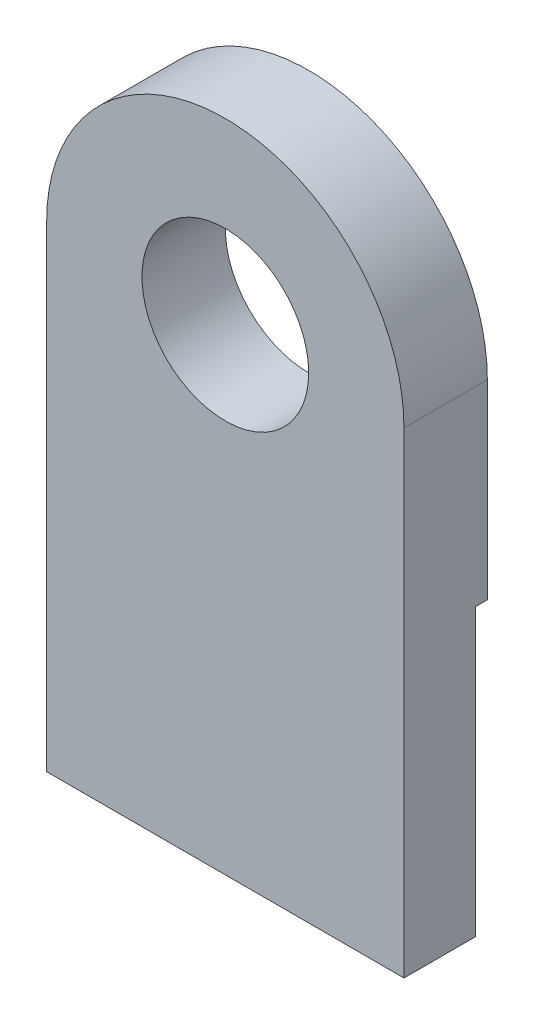
ISO-10303-21;
HEADER;
FILE_DESCRIPTION(('STEP AP214'),'2;1');
FILE_NAME('part.step','',(''),(''),'','','');
FILE_SCHEMA(('AUTOMOTIVE_DESIGN { 1 0 10303 214 1 1 1 1 }'));
ENDSEC;
DATA;
#1=APPLICATION_CONTEXT('core data for automotive mechanical design processes');
#2=APPLICATION_PROTOCOL_DEFINITION('international standard','automotive_design',2000,#1);
#3=PRODUCT_CONTEXT('',#1,'mechanical');
#4=PRODUCT('Part','Part','',(#3));
#5=PRODUCT_RELATED_PRODUCT_CATEGORY('part','',(#4));
#6=PRODUCT_DEFINITION_FORMATION('','',#4);
#7=PRODUCT_DEFINITION_CONTEXT('part definition',#1,'design');
#8=PRODUCT_DEFINITION('design','',#6,#7);
#9=PRODUCT_DEFINITION_SHAPE('','',#8);
#10=(LENGTH_UNIT() NAMED_UNIT(*) SI_UNIT(.MILLI.,.METRE.));
#11=(NAMED_UNIT(*) PLANE_ANGLE_UNIT() SI_UNIT($,.RADIAN.));
#12=(NAMED_UNIT(*) SI_UNIT($,.STERADIAN.) SOLID_ANGLE_UNIT());
#13=UNCERTAINTY_MEASURE_WITH_UNIT(LENGTH_MEASURE(1.E-05),#10,'distance_accuracy_value','');
#14=(GEOMETRIC_REPRESENTATION_CONTEXT(3) GLOBAL_UNCERTAINTY_ASSIGNED_CONTEXT((#13)) GLOBAL_UNIT_ASSIGNED_CONTEXT((#10,
#11,#12)) REPRESENTATION_CONTEXT('',''));
#15=CARTESIAN_POINT('',(0.,0.,0.));
#16=DIRECTION('',(0.,0.,1.));
#17=DIRECTION('',(1.,0.,0.));
#18=AXIS2_PLACEMENT_3D('',#15,#16,#17);
#19=CARTESIAN_POINT('',(0.,0.,3.));
#20=DIRECTION('',(1.,0.,0.));
#21=DIRECTION('',(0.,0.,-1.));
#22=AXIS2_PLACEMENT_3D('',#19,#20,#21);
#23=PLANE('',#22);
#24=DIRECTION('',(0.,-1.,0.));
#25=VECTOR('',#24,1.);
#26=CARTESIAN_POINT('',(0.,0.,0.));
#27=LINE('',#26,#25);
#28=CARTESIAN_POINT('',(0.,12.,0.));
#29=VERTEX_POINT('',#28);
#30=CARTESIAN_POINT('',(0.,0.,0.));
#31=VERTEX_POINT('',#30);
#32=EDGE_CURVE('E92',#29,#31,#27,.T.);
#33=ORIENTED_EDGE('',*,*,#32,.T.);
#34=DIRECTION('',(0.,0.,-1.));
#35=VECTOR('',#34,1.);
#36=CARTESIAN_POINT('',(0.,0.,3.));
#37=LINE('',#36,#35);
#38=CARTESIAN_POINT('',(0.,0.,3.));
#39=VERTEX_POINT('',#38);
#40=EDGE_CURVE('E11',#39,#31,#37,.T.);
#41=ORIENTED_EDGE('',*,*,#40,.F.);
#42=DIRECTION('',(0.,-1.,0.));
#43=VECTOR('',#42,1.);
#44=CARTESIAN_POINT('',(0.,0.,3.));
#45=LINE('',#44,#43);
#46=CARTESIAN_POINT('',(0.,20.,3.));
#47=VERTEX_POINT('',#46);
#48=EDGE_CURVE('E97',#47,#39,#45,.T.);
#49=ORIENTED_EDGE('',*,*,#48,.F.);
#50=DIRECTION('',(0.,0.,1.));
#51=VECTOR('',#50,1.);
#52=CARTESIAN_POINT('',(0.,20.,-0.5));
#53=LINE('',#52,#51);
#54=CARTESIAN_POINT('',(0.,20.,-0.5));
#55=VERTEX_POINT('',#54);
#56=EDGE_CURVE('E109',#55,#47,#53,.T.);
#57=ORIENTED_EDGE('',*,*,#56,.F.);
#58=DIRECTION('',(0.,1.,0.));
#59=VECTOR('',#58,1.);
#60=CARTESIAN_POINT('',(0.,0.,-0.5));
#61=LINE('',#60,#59);
#62=CARTESIAN_POINT('',(0.,12.,-0.5));
#63=VERTEX_POINT('',#62);
#64=EDGE_CURVE('E159',#63,#55,#61,.T.);
#65=ORIENTED_EDGE('',*,*,#64,.F.);
#66=DIRECTION('',(0.,0.,1.));
#67=VECTOR('',#66,1.);
#68=CARTESIAN_POINT('',(0.,12.,-0.5));
#69=LINE('',#68,#67);
#70=EDGE_CURVE('E104',#63,#29,#69,.T.);
#71=ORIENTED_EDGE('',*,*,#70,.T.);
#72=EDGE_LOOP('',(#33,#41,#49,#57,#65,#71));
#73=FACE_BOUND('',#72,.T.);
#74=ADVANCED_FACE('F41',(#73),#23,.F.);
#75=CARTESIAN_POINT('',(0.,0.,3.));
#76=DIRECTION('',(0.,1.,0.));
#77=DIRECTION('',(0.,0.,1.));
#78=AXIS2_PLACEMENT_3D('',#75,#76,#77);
#79=PLANE('',#78);
#80=DIRECTION('',(1.,0.,0.));
#81=VECTOR('',#80,1.);
#82=CARTESIAN_POINT('',(0.,0.,0.));
#83=LINE('',#82,#81);
#84=CARTESIAN_POINT('',(15.,0.,0.));
#85=VERTEX_POINT('',#84);
#86=EDGE_CURVE('E69',#31,#85,#83,.T.);
#87=ORIENTED_EDGE('',*,*,#86,.T.);
#88=DIRECTION('',(0.,0.,-1.));
#89=VECTOR('',#88,1.);
#90=CARTESIAN_POINT('',(15.,0.,3.));
#91=LINE('',#90,#89);
#92=CARTESIAN_POINT('',(15.,0.,3.));
#93=VERTEX_POINT('',#92);
#94=EDGE_CURVE('E50',#93,#85,#91,.T.);
#95=ORIENTED_EDGE('',*,*,#94,.F.);
#96=DIRECTION('',(1.,0.,0.));
#97=VECTOR('',#96,1.);
#98=CARTESIAN_POINT('',(0.,0.,3.));
#99=LINE('',#98,#97);
#100=EDGE_CURVE('E58',#39,#93,#99,.T.);
#101=ORIENTED_EDGE('',*,*,#100,.F.);
#102=ORIENTED_EDGE('',*,*,#40,.T.);
#103=EDGE_LOOP('',(#87,#95,#101,#102));
#104=FACE_BOUND('',#103,.T.);
#105=ADVANCED_FACE('F180',(#104),#79,.F.);
#106=CARTESIAN_POINT('',(15.,0.,3.));
#107=DIRECTION('',(-1.,0.,0.));
#108=DIRECTION('',(0.,0.,1.));
#109=AXIS2_PLACEMENT_3D('',#106,#107,#108);
#110=PLANE('',#109);
#111=DIRECTION('',(0.,1.,0.));
#112=VECTOR('',#111,1.);
#113=CARTESIAN_POINT('',(15.,0.,0.));
#114=LINE('',#113,#112);
#115=CARTESIAN_POINT('',(15.,12.,0.));
#116=VERTEX_POINT('',#115);
#117=EDGE_CURVE('E75',#85,#116,#114,.T.);
#118=ORIENTED_EDGE('',*,*,#117,.T.);
#119=DIRECTION('',(0.,0.,1.));
#120=VECTOR('',#119,1.);
#121=CARTESIAN_POINT('',(15.,12.,-0.5));
#122=LINE('',#121,#120);
#123=CARTESIAN_POINT('',(15.,12.,-0.5));
#124=VERTEX_POINT('',#123);
#125=EDGE_CURVE('E81',#124,#116,#122,.T.);
#126=ORIENTED_EDGE('',*,*,#125,.F.);
#127=DIRECTION('',(0.,1.,0.));
#128=VECTOR('',#127,1.);
#129=CARTESIAN_POINT('',(15.,0.,-0.5));
#130=LINE('',#129,#128);
#131=CARTESIAN_POINT('',(15.,20.,-0.5));
#132=VERTEX_POINT('',#131);
#133=EDGE_CURVE('E140',#124,#132,#130,.T.);
#134=ORIENTED_EDGE('',*,*,#133,.T.);
#135=DIRECTION('',(0.,0.,1.));
#136=VECTOR('',#135,1.);
#137=CARTESIAN_POINT('',(15.,20.,-0.5));
#138=LINE('',#137,#136);
#139=CARTESIAN_POINT('',(15.,20.,3.));
#140=VERTEX_POINT('',#139);
#141=EDGE_CURVE('E118',#132,#140,#138,.T.);
#142=ORIENTED_EDGE('',*,*,#141,.T.);
#143=DIRECTION('',(0.,1.,0.));
#144=VECTOR('',#143,1.);
#145=CARTESIAN_POINT('',(15.,0.,3.));
#146=LINE('',#145,#144);
#147=EDGE_CURVE('E126',#93,#140,#146,.T.);
#148=ORIENTED_EDGE('',*,*,#147,.F.);
#149=ORIENTED_EDGE('',*,*,#94,.T.);
#150=EDGE_LOOP('',(#118,#126,#134,#142,#148,#149));
#151=FACE_BOUND('',#150,.T.);
#152=ADVANCED_FACE('F77',(#151),#110,.F.);
#153=CARTESIAN_POINT('',(0.,0.,3.));
#154=DIRECTION('',(0.,0.,-1.));
#155=DIRECTION('',(-1.,0.,0.));
#156=AXIS2_PLACEMENT_3D('',#153,#154,#155);
#157=PLANE('',#156);
#158=ORIENTED_EDGE('',*,*,#48,.T.);
#159=ORIENTED_EDGE('',*,*,#100,.T.);
#160=ORIENTED_EDGE('',*,*,#147,.T.);
#161=CARTESIAN_POINT('',(7.5,20.,3.));
#162=DIRECTION('',(0.,0.,1.));
#163=DIRECTION('',(1.,0.,0.));
#164=AXIS2_PLACEMENT_3D('',#161,#162,#163);
#165=CIRCLE('',#164,7.5);
#166=EDGE_CURVE('E112',#140,#47,#165,.T.);
#167=ORIENTED_EDGE('',*,*,#166,.T.);
#168=EDGE_LOOP('',(#158,#159,#160,#167));
#169=FACE_BOUND('',#168,.T.);
#170=CARTESIAN_POINT('',(7.5,20.,3.));
#171=DIRECTION('',(0.,0.,1.));
#172=DIRECTION('',(1.,0.,0.));
#173=AXIS2_PLACEMENT_3D('',#170,#171,#172);
#174=CIRCLE('',#173,3.5);
#175=CARTESIAN_POINT('',(11.,20.,3.));
#176=VERTEX_POINT('',#175);
#177=EDGE_CURVE('E148',#176,#176,#174,.T.);
#178=ORIENTED_EDGE('',*,*,#177,.F.);
#179=EDGE_LOOP('',(#178));
#180=FACE_BOUND('',#179,.T.);
#181=ADVANCED_FACE('F133',(#169,#180),#157,.F.);
#182=CARTESIAN_POINT('',(0.,0.,0.));
#183=DIRECTION('',(0.,0.,-1.));
#184=DIRECTION('',(-1.,0.,0.));
#185=AXIS2_PLACEMENT_3D('',#182,#183,#184);
#186=PLANE('',#185);
#187=ORIENTED_EDGE('',*,*,#32,.F.);
#188=DIRECTION('',(-1.,0.,0.));
#189=VECTOR('',#188,1.);
#190=CARTESIAN_POINT('',(0.,12.,0.));
#191=LINE('',#190,#189);
#192=EDGE_CURVE('E86',#116,#29,#191,.T.);
#193=ORIENTED_EDGE('',*,*,#192,.F.);
#194=ORIENTED_EDGE('',*,*,#117,.F.);
#195=ORIENTED_EDGE('',*,*,#86,.F.);
#196=EDGE_LOOP('',(#187,#193,#194,#195));
#197=FACE_BOUND('',#196,.T.);
#198=ADVANCED_FACE('F90',(#197),#186,.T.);
#199=CARTESIAN_POINT('',(0.,12.,-0.5));
#200=DIRECTION('',(0.,1.,0.));
#201=DIRECTION('',(0.,0.,1.));
#202=AXIS2_PLACEMENT_3D('',#199,#200,#201);
#203=PLANE('',#202);
#204=ORIENTED_EDGE('',*,*,#125,.T.);
#205=ORIENTED_EDGE('',*,*,#192,.T.);
#206=ORIENTED_EDGE('',*,*,#70,.F.);
#207=DIRECTION('',(-1.,0.,0.));
#208=VECTOR('',#207,1.);
#209=CARTESIAN_POINT('',(0.,12.,-0.5));
#210=LINE('',#209,#208);
#211=EDGE_CURVE('E101',#124,#63,#210,.T.);
#212=ORIENTED_EDGE('',*,*,#211,.F.);
#213=EDGE_LOOP('',(#204,#205,#206,#212));
#214=FACE_BOUND('',#213,.T.);
#215=ADVANCED_FACE('F99',(#214),#203,.F.);
#216=CARTESIAN_POINT('',(7.5,20.,-0.5));
#217=DIRECTION('',(0.,0.,1.));
#218=DIRECTION('',(1.,0.,0.));
#219=AXIS2_PLACEMENT_3D('',#216,#217,#218);
#220=CYLINDRICAL_SURFACE('',#219,3.5);
#221=CARTESIAN_POINT('',(7.5,20.,-0.5));
#222=DIRECTION('',(0.,0.,1.));
#223=DIRECTION('',(1.,0.,0.));
#224=AXIS2_PLACEMENT_3D('',#221,#222,#223);
#225=CIRCLE('',#224,3.5);
#226=CARTESIAN_POINT('',(11.,20.,-0.5));
#227=VERTEX_POINT('',#226);
#228=EDGE_CURVE('E147',#227,#227,#225,.T.);
#229=ORIENTED_EDGE('',*,*,#228,.F.);
#230=EDGE_LOOP('',(#229));
#231=FACE_BOUND('',#230,.T.);
#232=ORIENTED_EDGE('',*,*,#177,.T.);
#233=EDGE_LOOP('',(#232));
#234=FACE_BOUND('',#233,.T.);
#235=ADVANCED_FACE('F192',(#231,#234),#220,.F.);
#236=CARTESIAN_POINT('',(7.5,20.,-0.5));
#237=DIRECTION('',(0.,0.,1.));
#238=DIRECTION('',(1.,0.,0.));
#239=AXIS2_PLACEMENT_3D('',#236,#237,#238);
#240=CYLINDRICAL_SURFACE('',#239,7.5);
#241=ORIENTED_EDGE('',*,*,#166,.F.);
#242=ORIENTED_EDGE('',*,*,#141,.F.);
#243=CARTESIAN_POINT('',(7.5,20.,-0.5));
#244=DIRECTION('',(0.,0.,1.));
#245=DIRECTION('',(1.,0.,0.));
#246=AXIS2_PLACEMENT_3D('',#243,#244,#245);
#247=CIRCLE('',#246,7.5);
#248=EDGE_CURVE('E163',#132,#55,#247,.T.);
#249=ORIENTED_EDGE('',*,*,#248,.T.);
#250=ORIENTED_EDGE('',*,*,#56,.T.);
#251=EDGE_LOOP('',(#241,#242,#249,#250));
#252=FACE_BOUND('',#251,.T.);
#253=ADVANCED_FACE('F144',(#252),#240,.T.);
#254=CARTESIAN_POINT('',(0.,0.,-0.5));
#255=DIRECTION('',(0.,0.,1.));
#256=DIRECTION('',(1.,0.,0.));
#257=AXIS2_PLACEMENT_3D('',#254,#255,#256);
#258=PLANE('',#257);
#259=ORIENTED_EDGE('',*,*,#228,.T.);
#260=EDGE_LOOP('',(#259));
#261=FACE_BOUND('',#260,.T.);
#262=ORIENTED_EDGE('',*,*,#133,.F.);
#263=ORIENTED_EDGE('',*,*,#211,.T.);
#264=ORIENTED_EDGE('',*,*,#64,.T.);
#265=ORIENTED_EDGE('',*,*,#248,.F.);
#266=EDGE_LOOP('',(#262,#263,#264,#265));
#267=FACE_BOUND('',#266,.T.);
#268=ADVANCED_FACE('F171',(#261,#267),#258,.F.);
#269=CLOSED_SHELL('',(#74,#105,#152,#181,#198,#215,#235,#253,#268));
#270=MANIFOLD_SOLID_BREP('B2',#269);
#271=ADVANCED_BREP_SHAPE_REPRESENTATION('',(#18,#270),#14);
#272=SHAPE_DEFINITION_REPRESENTATION(#9,#271);
ENDSEC;
END-ISO-10303-21;
